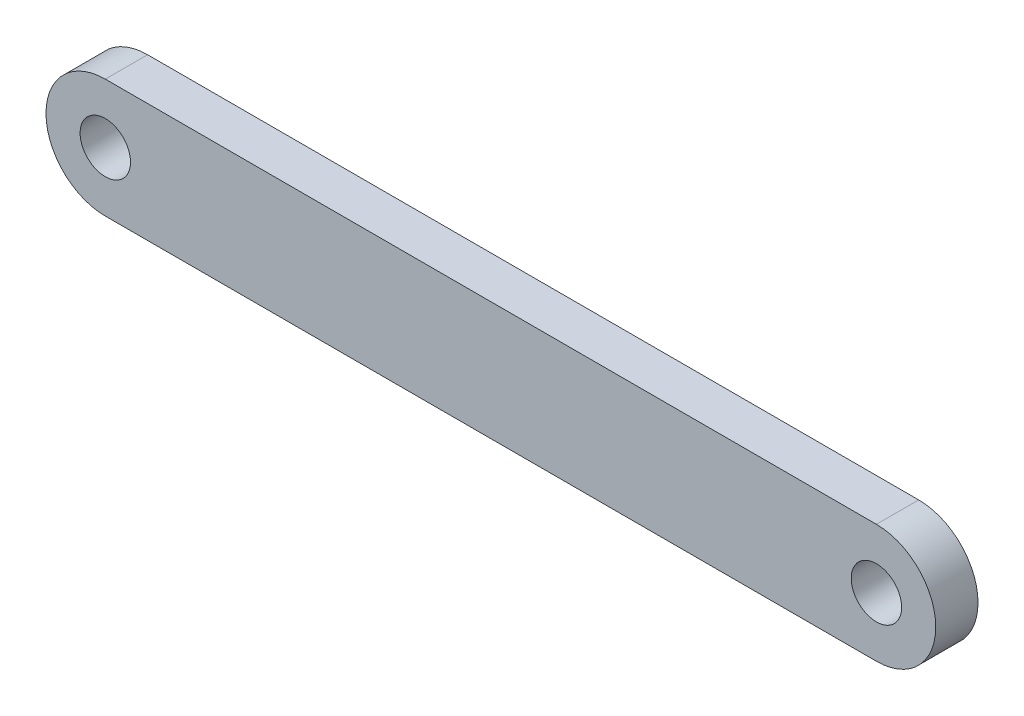
ISO-10303-21;
HEADER;
FILE_DESCRIPTION(('STEP AP214'),'2;1');
FILE_NAME('part.step','',(''),(''),'','','');
FILE_SCHEMA(('AUTOMOTIVE_DESIGN { 1 0 10303 214 1 1 1 1 }'));
ENDSEC;
DATA;
#1=APPLICATION_CONTEXT('core data for automotive mechanical design processes');
#2=APPLICATION_PROTOCOL_DEFINITION('international standard','automotive_design',2000,#1);
#3=PRODUCT_CONTEXT('',#1,'mechanical');
#4=PRODUCT('Part','Part','',(#3));
#5=PRODUCT_RELATED_PRODUCT_CATEGORY('part','',(#4));
#6=PRODUCT_DEFINITION_FORMATION('','',#4);
#7=PRODUCT_DEFINITION_CONTEXT('part definition',#1,'design');
#8=PRODUCT_DEFINITION('design','',#6,#7);
#9=PRODUCT_DEFINITION_SHAPE('','',#8);
#10=(LENGTH_UNIT() NAMED_UNIT(*) SI_UNIT(.MILLI.,.METRE.));
#11=(NAMED_UNIT(*) PLANE_ANGLE_UNIT() SI_UNIT($,.RADIAN.));
#12=(NAMED_UNIT(*) SI_UNIT($,.STERADIAN.) SOLID_ANGLE_UNIT());
#13=UNCERTAINTY_MEASURE_WITH_UNIT(LENGTH_MEASURE(1.E-05),#10,'distance_accuracy_value','');
#14=(GEOMETRIC_REPRESENTATION_CONTEXT(3) GLOBAL_UNCERTAINTY_ASSIGNED_CONTEXT((#13)) GLOBAL_UNIT_ASSIGNED_CONTEXT((#10,
#11,#12)) REPRESENTATION_CONTEXT('',''));
#15=CARTESIAN_POINT('',(0.,0.,0.));
#16=DIRECTION('',(0.,0.,1.));
#17=DIRECTION('',(1.,0.,0.));
#18=AXIS2_PLACEMENT_3D('',#15,#16,#17);
#19=CARTESIAN_POINT('',(0.,0.,2.85));
#20=DIRECTION('',(0.,0.,1.));
#21=DIRECTION('',(1.,0.,0.));
#22=AXIS2_PLACEMENT_3D('',#19,#20,#21);
#23=PLANE('',#22);
#24=DIRECTION('',(-1.,0.,0.));
#25=VECTOR('',#24,1.);
#26=CARTESIAN_POINT('',(-30.,4.,2.85));
#27=LINE('',#26,#25);
#28=CARTESIAN_POINT('',(26.,4.,2.85));
#29=VERTEX_POINT('',#28);
#30=CARTESIAN_POINT('',(-26.,4.,2.85));
#31=VERTEX_POINT('',#30);
#32=EDGE_CURVE('E79',#29,#31,#27,.T.);
#33=ORIENTED_EDGE('',*,*,#32,.T.);
#34=CARTESIAN_POINT('',(-26.,0.,2.85));
#35=DIRECTION('',(0.,0.,1.));
#36=DIRECTION('',(-1.,0.,0.));
#37=AXIS2_PLACEMENT_3D('',#34,#35,#36);
#38=CIRCLE('',#37,4.);
#39=CARTESIAN_POINT('',(-26.,-4.,2.85));
#40=VERTEX_POINT('',#39);
#41=EDGE_CURVE('E76',#31,#40,#38,.T.);
#42=ORIENTED_EDGE('',*,*,#41,.T.);
#43=DIRECTION('',(1.,0.,0.));
#44=VECTOR('',#43,1.);
#45=CARTESIAN_POINT('',(-30.,-4.,2.85));
#46=LINE('',#45,#44);
#47=CARTESIAN_POINT('',(26.,-4.,2.85));
#48=VERTEX_POINT('',#47);
#49=EDGE_CURVE('E61',#40,#48,#46,.T.);
#50=ORIENTED_EDGE('',*,*,#49,.T.);
#51=CARTESIAN_POINT('',(26.,0.,2.85));
#52=DIRECTION('',(0.,0.,-1.));
#53=DIRECTION('',(1.,0.,0.));
#54=AXIS2_PLACEMENT_3D('',#51,#52,#53);
#55=CIRCLE('',#54,4.);
#56=EDGE_CURVE('E104',#29,#48,#55,.T.);
#57=ORIENTED_EDGE('',*,*,#56,.F.);
#58=EDGE_LOOP('',(#33,#42,#50,#57));
#59=FACE_BOUND('',#58,.T.);
#60=CARTESIAN_POINT('',(26.,0.,2.85));
#61=DIRECTION('',(0.,0.,1.));
#62=DIRECTION('',(1.,0.,0.));
#63=AXIS2_PLACEMENT_3D('',#60,#61,#62);
#64=CIRCLE('',#63,1.7);
#65=CARTESIAN_POINT('',(27.7,0.,2.85));
#66=VERTEX_POINT('',#65);
#67=EDGE_CURVE('E88',#66,#66,#64,.T.);
#68=ORIENTED_EDGE('',*,*,#67,.F.);
#69=EDGE_LOOP('',(#68));
#70=FACE_BOUND('',#69,.T.);
#71=CARTESIAN_POINT('',(-26.,0.,2.85));
#72=DIRECTION('',(0.,0.,-1.));
#73=DIRECTION('',(-1.,0.,0.));
#74=AXIS2_PLACEMENT_3D('',#71,#72,#73);
#75=CIRCLE('',#74,1.7);
#76=CARTESIAN_POINT('',(-27.7,0.,2.85));
#77=VERTEX_POINT('',#76);
#78=EDGE_CURVE('E118',#77,#77,#75,.T.);
#79=ORIENTED_EDGE('',*,*,#78,.T.);
#80=EDGE_LOOP('',(#79));
#81=FACE_BOUND('',#80,.T.);
#82=ADVANCED_FACE('F33',(#59,#70,#81),#23,.T.);
#83=CARTESIAN_POINT('',(0.,0.,0.));
#84=DIRECTION('',(0.,0.,1.));
#85=DIRECTION('',(1.,0.,0.));
#86=AXIS2_PLACEMENT_3D('',#83,#84,#85);
#87=PLANE('',#86);
#88=CARTESIAN_POINT('',(-26.,0.,0.));
#89=DIRECTION('',(0.,0.,1.));
#90=DIRECTION('',(1.,0.,0.));
#91=AXIS2_PLACEMENT_3D('',#88,#89,#90);
#92=CIRCLE('',#91,4.);
#93=CARTESIAN_POINT('',(-26.,4.,0.));
#94=VERTEX_POINT('',#93);
#95=CARTESIAN_POINT('',(-26.,-4.,0.));
#96=VERTEX_POINT('',#95);
#97=EDGE_CURVE('E11',#94,#96,#92,.T.);
#98=ORIENTED_EDGE('',*,*,#97,.F.);
#99=DIRECTION('',(-1.,0.,0.));
#100=VECTOR('',#99,1.);
#101=CARTESIAN_POINT('',(-30.,4.,0.));
#102=LINE('',#101,#100);
#103=CARTESIAN_POINT('',(26.,4.,0.));
#104=VERTEX_POINT('',#103);
#105=EDGE_CURVE('E98',#104,#94,#102,.T.);
#106=ORIENTED_EDGE('',*,*,#105,.F.);
#107=CARTESIAN_POINT('',(26.,0.,0.));
#108=DIRECTION('',(0.,0.,1.));
#109=DIRECTION('',(1.,0.,0.));
#110=AXIS2_PLACEMENT_3D('',#107,#108,#109);
#111=CIRCLE('',#110,4.);
#112=CARTESIAN_POINT('',(26.,-4.,0.));
#113=VERTEX_POINT('',#112);
#114=EDGE_CURVE('E42',#104,#113,#111,.F.);
#115=ORIENTED_EDGE('',*,*,#114,.T.);
#116=DIRECTION('',(1.,0.,0.));
#117=VECTOR('',#116,1.);
#118=CARTESIAN_POINT('',(-30.,-4.,0.));
#119=LINE('',#118,#117);
#120=EDGE_CURVE('E94',#96,#113,#119,.T.);
#121=ORIENTED_EDGE('',*,*,#120,.F.);
#122=EDGE_LOOP('',(#98,#106,#115,#121));
#123=FACE_BOUND('',#122,.T.);
#124=CARTESIAN_POINT('',(26.,0.,0.));
#125=DIRECTION('',(0.,0.,1.));
#126=DIRECTION('',(1.,0.,0.));
#127=AXIS2_PLACEMENT_3D('',#124,#125,#126);
#128=CIRCLE('',#127,1.7);
#129=CARTESIAN_POINT('',(27.7,0.,0.));
#130=VERTEX_POINT('',#129);
#131=EDGE_CURVE('E112',#130,#130,#128,.T.);
#132=ORIENTED_EDGE('',*,*,#131,.T.);
#133=EDGE_LOOP('',(#132));
#134=FACE_BOUND('',#133,.T.);
#135=CARTESIAN_POINT('',(-26.,0.,0.));
#136=DIRECTION('',(0.,0.,-1.));
#137=DIRECTION('',(-1.,0.,0.));
#138=AXIS2_PLACEMENT_3D('',#135,#136,#137);
#139=CIRCLE('',#138,1.7);
#140=CARTESIAN_POINT('',(-27.7,0.,0.));
#141=VERTEX_POINT('',#140);
#142=EDGE_CURVE('E82',#141,#141,#139,.T.);
#143=ORIENTED_EDGE('',*,*,#142,.F.);
#144=EDGE_LOOP('',(#143));
#145=FACE_BOUND('',#144,.T.);
#146=ADVANCED_FACE('F106',(#123,#134,#145),#87,.F.);
#147=CARTESIAN_POINT('',(-30.,-4.,2.85));
#148=DIRECTION('',(0.,1.,0.));
#149=DIRECTION('',(0.,0.,1.));
#150=AXIS2_PLACEMENT_3D('',#147,#148,#149);
#151=PLANE('',#150);
#152=DIRECTION('',(0.,0.,1.));
#153=VECTOR('',#152,1.);
#154=CARTESIAN_POINT('',(-26.,-4.,0.));
#155=LINE('',#154,#153);
#156=EDGE_CURVE('E84',#96,#40,#155,.T.);
#157=ORIENTED_EDGE('',*,*,#156,.F.);
#158=ORIENTED_EDGE('',*,*,#120,.T.);
#159=DIRECTION('',(0.,0.,1.));
#160=VECTOR('',#159,1.);
#161=CARTESIAN_POINT('',(26.,-4.,0.));
#162=LINE('',#161,#160);
#163=EDGE_CURVE('E92',#113,#48,#162,.T.);
#164=ORIENTED_EDGE('',*,*,#163,.T.);
#165=ORIENTED_EDGE('',*,*,#49,.F.);
#166=EDGE_LOOP('',(#157,#158,#164,#165));
#167=FACE_BOUND('',#166,.T.);
#168=ADVANCED_FACE('F91',(#167),#151,.F.);
#169=CARTESIAN_POINT('',(-30.,4.,2.85));
#170=DIRECTION('',(0.,-1.,0.));
#171=DIRECTION('',(0.,0.,-1.));
#172=AXIS2_PLACEMENT_3D('',#169,#170,#171);
#173=PLANE('',#172);
#174=ORIENTED_EDGE('',*,*,#105,.T.);
#175=DIRECTION('',(0.,0.,1.));
#176=VECTOR('',#175,1.);
#177=CARTESIAN_POINT('',(-26.,4.,0.));
#178=LINE('',#177,#176);
#179=EDGE_CURVE('E81',#94,#31,#178,.T.);
#180=ORIENTED_EDGE('',*,*,#179,.T.);
#181=ORIENTED_EDGE('',*,*,#32,.F.);
#182=DIRECTION('',(0.,0.,1.));
#183=VECTOR('',#182,1.);
#184=CARTESIAN_POINT('',(26.,4.,0.));
#185=LINE('',#184,#183);
#186=EDGE_CURVE('E101',#104,#29,#185,.T.);
#187=ORIENTED_EDGE('',*,*,#186,.F.);
#188=EDGE_LOOP('',(#174,#180,#181,#187));
#189=FACE_BOUND('',#188,.T.);
#190=ADVANCED_FACE('F35',(#189),#173,.F.);
#191=CARTESIAN_POINT('',(26.,0.,0.));
#192=DIRECTION('',(0.,0.,1.));
#193=DIRECTION('',(1.,0.,0.));
#194=AXIS2_PLACEMENT_3D('',#191,#192,#193);
#195=CYLINDRICAL_SURFACE('',#194,4.);
#196=ORIENTED_EDGE('',*,*,#56,.T.);
#197=ORIENTED_EDGE('',*,*,#163,.F.);
#198=ORIENTED_EDGE('',*,*,#114,.F.);
#199=ORIENTED_EDGE('',*,*,#186,.T.);
#200=EDGE_LOOP('',(#196,#197,#198,#199));
#201=FACE_BOUND('',#200,.T.);
#202=ADVANCED_FACE('F103',(#201),#195,.T.);
#203=CARTESIAN_POINT('',(26.,0.,0.));
#204=DIRECTION('',(0.,0.,1.));
#205=DIRECTION('',(1.,0.,0.));
#206=AXIS2_PLACEMENT_3D('',#203,#204,#205);
#207=CYLINDRICAL_SURFACE('',#206,1.7);
#208=ORIENTED_EDGE('',*,*,#131,.F.);
#209=EDGE_LOOP('',(#208));
#210=FACE_BOUND('',#209,.T.);
#211=ORIENTED_EDGE('',*,*,#67,.T.);
#212=EDGE_LOOP('',(#211));
#213=FACE_BOUND('',#212,.T.);
#214=ADVANCED_FACE('F137',(#210,#213),#207,.F.);
#215=CARTESIAN_POINT('',(-26.,0.,0.));
#216=DIRECTION('',(0.,0.,1.));
#217=DIRECTION('',(1.,0.,0.));
#218=AXIS2_PLACEMENT_3D('',#215,#216,#217);
#219=CYLINDRICAL_SURFACE('',#218,4.);
#220=ORIENTED_EDGE('',*,*,#179,.F.);
#221=ORIENTED_EDGE('',*,*,#97,.T.);
#222=ORIENTED_EDGE('',*,*,#156,.T.);
#223=ORIENTED_EDGE('',*,*,#41,.F.);
#224=EDGE_LOOP('',(#220,#221,#222,#223));
#225=FACE_BOUND('',#224,.T.);
#226=ADVANCED_FACE('F85',(#225),#219,.T.);
#227=CARTESIAN_POINT('',(-26.,0.,0.));
#228=DIRECTION('',(0.,0.,1.));
#229=DIRECTION('',(1.,0.,0.));
#230=AXIS2_PLACEMENT_3D('',#227,#228,#229);
#231=CYLINDRICAL_SURFACE('',#230,1.7);
#232=ORIENTED_EDGE('',*,*,#142,.T.);
#233=EDGE_LOOP('',(#232));
#234=FACE_BOUND('',#233,.T.);
#235=ORIENTED_EDGE('',*,*,#78,.F.);
#236=EDGE_LOOP('',(#235));
#237=FACE_BOUND('',#236,.T.);
#238=ADVANCED_FACE('F124',(#234,#237),#231,.F.);
#239=CLOSED_SHELL('',(#82,#146,#168,#190,#202,#214,#226,#238));
#240=MANIFOLD_SOLID_BREP('B2',#239);
#241=ADVANCED_BREP_SHAPE_REPRESENTATION('',(#18,#240),#14);
#242=SHAPE_DEFINITION_REPRESENTATION(#9,#241);
ENDSEC;
END-ISO-10303-21;
